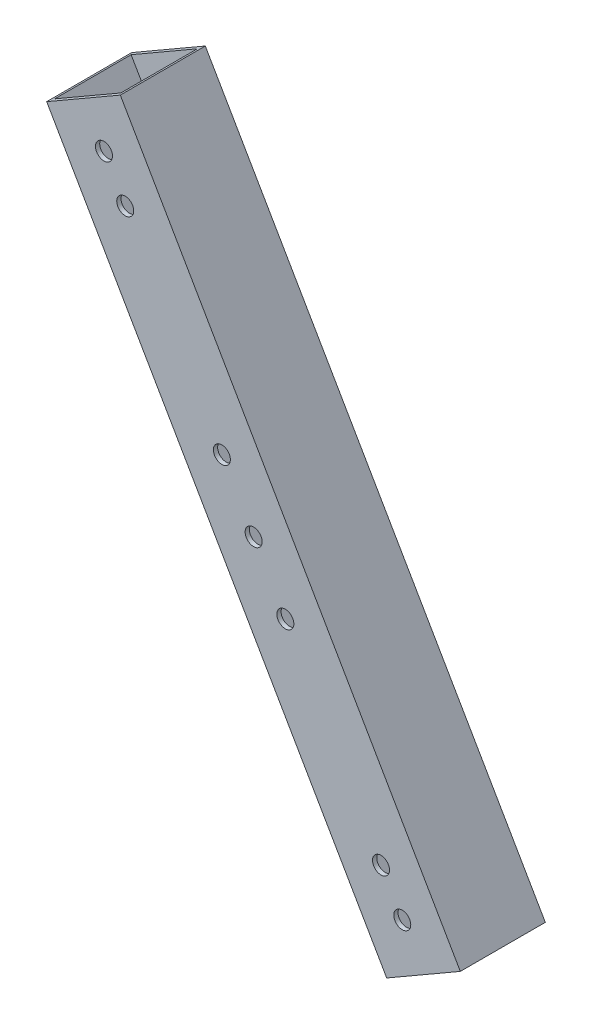
ISO-10303-21;
HEADER;
FILE_DESCRIPTION(('STEP AP214'),'2;1');
FILE_NAME('part.step','',(''),(''),'','','');
FILE_SCHEMA(('AUTOMOTIVE_DESIGN { 1 0 10303 214 1 1 1 1 }'));
ENDSEC;
DATA;
#1=APPLICATION_CONTEXT('core data for automotive mechanical design processes');
#2=APPLICATION_PROTOCOL_DEFINITION('international standard','automotive_design',2000,#1);
#3=PRODUCT_CONTEXT('',#1,'mechanical');
#4=PRODUCT('Part','Part','',(#3));
#5=PRODUCT_RELATED_PRODUCT_CATEGORY('part','',(#4));
#6=PRODUCT_DEFINITION_FORMATION('','',#4);
#7=PRODUCT_DEFINITION_CONTEXT('part definition',#1,'design');
#8=PRODUCT_DEFINITION('design','',#6,#7);
#9=PRODUCT_DEFINITION_SHAPE('','',#8);
#10=(LENGTH_UNIT() NAMED_UNIT(*) SI_UNIT(.MILLI.,.METRE.));
#11=(NAMED_UNIT(*) PLANE_ANGLE_UNIT() SI_UNIT($,.RADIAN.));
#12=(NAMED_UNIT(*) SI_UNIT($,.STERADIAN.) SOLID_ANGLE_UNIT());
#13=UNCERTAINTY_MEASURE_WITH_UNIT(LENGTH_MEASURE(1.E-05),#10,'distance_accuracy_value','');
#14=(GEOMETRIC_REPRESENTATION_CONTEXT(3) GLOBAL_UNCERTAINTY_ASSIGNED_CONTEXT((#13)) GLOBAL_UNIT_ASSIGNED_CONTEXT((#10,
#11,#12)) REPRESENTATION_CONTEXT('',''));
#15=CARTESIAN_POINT('',(0.,0.,0.));
#16=DIRECTION('',(0.,0.,1.));
#17=DIRECTION('',(1.,0.,0.));
#18=AXIS2_PLACEMENT_3D('',#15,#16,#17);
#19=CARTESIAN_POINT('',(-35.2463581705699,60.4985392870756,20.));
#20=DIRECTION('',(0.,0.,-1.));
#21=DIRECTION('',(-1.,0.,0.));
#22=AXIS2_PLACEMENT_3D('',#19,#20,#21);
#23=CYLINDRICAL_SURFACE('',#22,2.00000000000002);
#24=CARTESIAN_POINT('',(-35.2463581705699,60.4985392870756,19.));
#25=DIRECTION('',(0.,0.,1.));
#26=DIRECTION('',(1.,0.,0.));
#27=AXIS2_PLACEMENT_3D('',#24,#25,#26);
#28=CIRCLE('',#27,2.00000000000002);
#29=CARTESIAN_POINT('',(-33.2463581705699,60.4985392870756,19.));
#30=VERTEX_POINT('',#29);
#31=EDGE_CURVE('E193',#30,#30,#28,.T.);
#32=ORIENTED_EDGE('',*,*,#31,.F.);
#33=EDGE_LOOP('',(#32));
#34=FACE_BOUND('',#33,.T.);
#35=CARTESIAN_POINT('',(-35.2463581705699,60.4985392870756,20.));
#36=DIRECTION('',(0.,0.,1.));
#37=DIRECTION('',(1.,0.,0.));
#38=AXIS2_PLACEMENT_3D('',#35,#36,#37);
#39=CIRCLE('',#38,2.00000000000002);
#40=CARTESIAN_POINT('',(-33.2463581705699,60.4985392870756,20.));
#41=VERTEX_POINT('',#40);
#42=EDGE_CURVE('E250',#41,#41,#39,.T.);
#43=ORIENTED_EDGE('',*,*,#42,.T.);
#44=EDGE_LOOP('',(#43));
#45=FACE_BOUND('',#44,.T.);
#46=ADVANCED_FACE('F45',(#34,#45),#23,.F.);
#47=CARTESIAN_POINT('',(-30.2463581705699,51.8382852492312,20.));
#48=DIRECTION('',(0.,0.,-1.));
#49=DIRECTION('',(-1.,0.,0.));
#50=AXIS2_PLACEMENT_3D('',#47,#48,#49);
#51=CYLINDRICAL_SURFACE('',#50,1.99999999999997);
#52=CARTESIAN_POINT('',(-30.2463581705699,51.8382852492312,19.));
#53=DIRECTION('',(0.,0.,1.));
#54=DIRECTION('',(1.,0.,0.));
#55=AXIS2_PLACEMENT_3D('',#52,#53,#54);
#56=CIRCLE('',#55,1.99999999999997);
#57=CARTESIAN_POINT('',(-28.2463581705699,51.8382852492312,19.));
#58=VERTEX_POINT('',#57);
#59=EDGE_CURVE('E189',#58,#58,#56,.T.);
#60=ORIENTED_EDGE('',*,*,#59,.F.);
#61=EDGE_LOOP('',(#60));
#62=FACE_BOUND('',#61,.T.);
#63=CARTESIAN_POINT('',(-30.2463581705699,51.8382852492312,20.));
#64=DIRECTION('',(0.,0.,1.));
#65=DIRECTION('',(1.,0.,0.));
#66=AXIS2_PLACEMENT_3D('',#63,#64,#65);
#67=CIRCLE('',#66,1.99999999999997);
#68=CARTESIAN_POINT('',(-28.2463581705699,51.8382852492312,20.));
#69=VERTEX_POINT('',#68);
#70=EDGE_CURVE('E242',#69,#69,#67,.T.);
#71=ORIENTED_EDGE('',*,*,#70,.T.);
#72=EDGE_LOOP('',(#71));
#73=FACE_BOUND('',#72,.T.);
#74=ADVANCED_FACE('F325',(#62,#73),#51,.F.);
#75=CARTESIAN_POINT('',(-7.50186371385041,12.5282612160935,20.));
#76=DIRECTION('',(0.,0.,-1.));
#77=DIRECTION('',(-1.,0.,0.));
#78=AXIS2_PLACEMENT_3D('',#75,#76,#77);
#79=CYLINDRICAL_SURFACE('',#78,2.00000000000002);
#80=CARTESIAN_POINT('',(-7.50186371385041,12.5282612160935,19.));
#81=DIRECTION('',(0.,0.,1.));
#82=DIRECTION('',(1.,0.,0.));
#83=AXIS2_PLACEMENT_3D('',#80,#81,#82);
#84=CIRCLE('',#83,2.00000000000002);
#85=CARTESIAN_POINT('',(-5.50186371385038,12.5282612160935,19.));
#86=VERTEX_POINT('',#85);
#87=EDGE_CURVE('E185',#86,#86,#84,.T.);
#88=ORIENTED_EDGE('',*,*,#87,.F.);
#89=EDGE_LOOP('',(#88));
#90=FACE_BOUND('',#89,.T.);
#91=CARTESIAN_POINT('',(-7.50186371385041,12.5282612160935,20.));
#92=DIRECTION('',(0.,0.,1.));
#93=DIRECTION('',(1.,0.,0.));
#94=AXIS2_PLACEMENT_3D('',#91,#92,#93);
#95=CIRCLE('',#94,2.00000000000002);
#96=CARTESIAN_POINT('',(-5.50186371385038,12.5282612160935,20.));
#97=VERTEX_POINT('',#96);
#98=EDGE_CURVE('E234',#97,#97,#95,.T.);
#99=ORIENTED_EDGE('',*,*,#98,.T.);
#100=EDGE_LOOP('',(#99));
#101=FACE_BOUND('',#100,.T.);
#102=ADVANCED_FACE('F333',(#90,#101),#79,.F.);
#103=CARTESIAN_POINT('',(-0.0377448382468809,-0.482835817502303,20.));
#104=DIRECTION('',(0.,0.,-1.));
#105=DIRECTION('',(-1.,0.,0.));
#106=AXIS2_PLACEMENT_3D('',#103,#104,#105);
#107=CYLINDRICAL_SURFACE('',#106,2.);
#108=CARTESIAN_POINT('',(-0.0377448382468809,-0.482835817502303,19.));
#109=DIRECTION('',(0.,0.,1.));
#110=DIRECTION('',(1.,0.,0.));
#111=AXIS2_PLACEMENT_3D('',#108,#109,#110);
#112=CIRCLE('',#111,2.);
#113=CARTESIAN_POINT('',(1.96225516175312,-0.482835817502303,19.));
#114=VERTEX_POINT('',#113);
#115=EDGE_CURVE('E181',#114,#114,#112,.T.);
#116=ORIENTED_EDGE('',*,*,#115,.F.);
#117=EDGE_LOOP('',(#116));
#118=FACE_BOUND('',#117,.T.);
#119=CARTESIAN_POINT('',(-0.0377448382468809,-0.482835817502303,20.));
#120=DIRECTION('',(0.,0.,1.));
#121=DIRECTION('',(1.,0.,0.));
#122=AXIS2_PLACEMENT_3D('',#119,#120,#121);
#123=CIRCLE('',#122,2.);
#124=CARTESIAN_POINT('',(1.96225516175312,-0.482835817502303,20.));
#125=VERTEX_POINT('',#124);
#126=EDGE_CURVE('E226',#125,#125,#123,.T.);
#127=ORIENTED_EDGE('',*,*,#126,.T.);
#128=EDGE_LOOP('',(#127));
#129=FACE_BOUND('',#128,.T.);
#130=ADVANCED_FACE('F407',(#118,#129),#107,.F.);
#131=CARTESIAN_POINT('',(7.42637403735612,-13.4939328510983,20.));
#132=DIRECTION('',(0.,0.,-1.));
#133=DIRECTION('',(-1.,0.,0.));
#134=AXIS2_PLACEMENT_3D('',#131,#132,#133);
#135=CYLINDRICAL_SURFACE('',#134,1.99999999999998);
#136=CARTESIAN_POINT('',(7.42637403735612,-13.4939328510983,19.));
#137=DIRECTION('',(0.,0.,1.));
#138=DIRECTION('',(1.,0.,0.));
#139=AXIS2_PLACEMENT_3D('',#136,#137,#138);
#140=CIRCLE('',#139,1.99999999999998);
#141=CARTESIAN_POINT('',(9.4263740373561,-13.4939328510983,19.));
#142=VERTEX_POINT('',#141);
#143=EDGE_CURVE('E177',#142,#142,#140,.T.);
#144=ORIENTED_EDGE('',*,*,#143,.F.);
#145=EDGE_LOOP('',(#144));
#146=FACE_BOUND('',#145,.T.);
#147=CARTESIAN_POINT('',(7.42637403735612,-13.4939328510983,20.));
#148=DIRECTION('',(0.,0.,1.));
#149=DIRECTION('',(1.,0.,0.));
#150=AXIS2_PLACEMENT_3D('',#147,#148,#149);
#151=CIRCLE('',#150,1.99999999999998);
#152=CARTESIAN_POINT('',(9.4263740373561,-13.4939328510983,20.));
#153=VERTEX_POINT('',#152);
#154=EDGE_CURVE('E218',#153,#153,#151,.T.);
#155=ORIENTED_EDGE('',*,*,#154,.T.);
#156=EDGE_LOOP('',(#155));
#157=FACE_BOUND('',#156,.T.);
#158=ADVANCED_FACE('F397',(#146,#157),#135,.F.);
#159=CARTESIAN_POINT('',(29.9331337537406,-52.3956523373563,20.));
#160=DIRECTION('',(0.,0.,-1.));
#161=DIRECTION('',(-1.,0.,0.));
#162=AXIS2_PLACEMENT_3D('',#159,#160,#161);
#163=CYLINDRICAL_SURFACE('',#162,2.00000000000002);
#164=CARTESIAN_POINT('',(29.9331337537406,-52.3956523373563,19.));
#165=DIRECTION('',(0.,0.,1.));
#166=DIRECTION('',(1.,0.,0.));
#167=AXIS2_PLACEMENT_3D('',#164,#165,#166);
#168=CIRCLE('',#167,2.00000000000002);
#169=CARTESIAN_POINT('',(31.9331337537406,-52.3956523373563,19.));
#170=VERTEX_POINT('',#169);
#171=EDGE_CURVE('E173',#170,#170,#168,.T.);
#172=ORIENTED_EDGE('',*,*,#171,.F.);
#173=EDGE_LOOP('',(#172));
#174=FACE_BOUND('',#173,.T.);
#175=CARTESIAN_POINT('',(29.9331337537406,-52.3956523373563,20.));
#176=DIRECTION('',(0.,0.,1.));
#177=DIRECTION('',(1.,0.,0.));
#178=AXIS2_PLACEMENT_3D('',#175,#176,#177);
#179=CIRCLE('',#178,2.00000000000002);
#180=CARTESIAN_POINT('',(31.9331337537406,-52.3956523373563,20.));
#181=VERTEX_POINT('',#180);
#182=EDGE_CURVE('E210',#181,#181,#179,.T.);
#183=ORIENTED_EDGE('',*,*,#182,.T.);
#184=EDGE_LOOP('',(#183));
#185=FACE_BOUND('',#184,.T.);
#186=ADVANCED_FACE('F387',(#174,#185),#163,.F.);
#187=CARTESIAN_POINT('',(34.9331337537406,-61.0559063752009,20.));
#188=DIRECTION('',(0.,0.,-1.));
#189=DIRECTION('',(-1.,0.,0.));
#190=AXIS2_PLACEMENT_3D('',#187,#188,#189);
#191=CYLINDRICAL_SURFACE('',#190,2.00000000000004);
#192=CARTESIAN_POINT('',(34.9331337537406,-61.0559063752009,19.));
#193=DIRECTION('',(0.,0.,1.));
#194=DIRECTION('',(1.,0.,0.));
#195=AXIS2_PLACEMENT_3D('',#192,#193,#194);
#196=CIRCLE('',#195,2.00000000000004);
#197=CARTESIAN_POINT('',(36.9331337537407,-61.0559063752009,19.));
#198=VERTEX_POINT('',#197);
#199=EDGE_CURVE('E172',#198,#198,#196,.T.);
#200=ORIENTED_EDGE('',*,*,#199,.F.);
#201=EDGE_LOOP('',(#200));
#202=FACE_BOUND('',#201,.T.);
#203=CARTESIAN_POINT('',(34.9331337537406,-61.0559063752009,20.));
#204=DIRECTION('',(0.,0.,1.));
#205=DIRECTION('',(1.,0.,0.));
#206=AXIS2_PLACEMENT_3D('',#203,#204,#205);
#207=CIRCLE('',#206,2.00000000000004);
#208=CARTESIAN_POINT('',(36.9331337537407,-61.0559063752009,20.));
#209=VERTEX_POINT('',#208);
#210=EDGE_CURVE('E202',#209,#209,#207,.T.);
#211=ORIENTED_EDGE('',*,*,#210,.T.);
#212=EDGE_LOOP('',(#211));
#213=FACE_BOUND('',#212,.T.);
#214=ADVANCED_FACE('F378',(#202,#213),#191,.F.);
#215=CARTESIAN_POINT('',(0.,0.,20.));
#216=DIRECTION('',(0.,0.,1.));
#217=DIRECTION('',(1.,0.,0.));
#218=AXIS2_PLACEMENT_3D('',#215,#216,#217);
#219=PLANE('',#218);
#220=ORIENTED_EDGE('',*,*,#182,.F.);
#221=EDGE_LOOP('',(#220));
#222=FACE_BOUND('',#221,.T.);
#223=ORIENTED_EDGE('',*,*,#126,.F.);
#224=EDGE_LOOP('',(#223));
#225=FACE_BOUND('',#224,.T.);
#226=ORIENTED_EDGE('',*,*,#70,.F.);
#227=EDGE_LOOP('',(#226));
#228=FACE_BOUND('',#227,.T.);
#229=DIRECTION('',(-0.866025403784442,-0.499999999999995,0.));
#230=VECTOR('',#229,1.);
#231=CARTESIAN_POINT('',(-31.4066122084144,73.8479041924647,20.));
#232=LINE('',#231,#230);
#233=CARTESIAN_POINT('',(-31.4066122084144,73.8479041924647,20.));
#234=VERTEX_POINT('',#233);
#235=CARTESIAN_POINT('',(-48.7271202841034,63.8479041924647,20.));
#236=VERTEX_POINT('',#235);
#237=EDGE_CURVE('E258',#234,#236,#232,.T.);
#238=ORIENTED_EDGE('',*,*,#237,.T.);
#239=DIRECTION('',(0.5,-0.866025403784439,0.));
#240=VECTOR('',#239,1.);
#241=CARTESIAN_POINT('',(-48.7271202841034,63.8479041924647,20.));
#242=LINE('',#241,#240);
#243=CARTESIAN_POINT('',(31.2728797158966,-74.7161604130455,20.));
#244=VERTEX_POINT('',#243);
#245=EDGE_CURVE('E262',#236,#244,#242,.T.);
#246=ORIENTED_EDGE('',*,*,#245,.T.);
#247=DIRECTION('',(0.866025403784436,0.500000000000004,0.));
#248=VECTOR('',#247,1.);
#249=CARTESIAN_POINT('',(31.2728797158966,-74.7161604130455,20.));
#250=LINE('',#249,#248);
#251=CARTESIAN_POINT('',(48.5933877915854,-64.7161604130454,20.));
#252=VERTEX_POINT('',#251);
#253=EDGE_CURVE('E266',#244,#252,#250,.T.);
#254=ORIENTED_EDGE('',*,*,#253,.T.);
#255=DIRECTION('',(-0.499999999999999,0.866025403784439,0.));
#256=VECTOR('',#255,1.);
#257=CARTESIAN_POINT('',(48.5933877915854,-64.7161604130454,20.));
#258=LINE('',#257,#256);
#259=EDGE_CURVE('E269',#252,#234,#258,.T.);
#260=ORIENTED_EDGE('',*,*,#259,.T.);
#261=EDGE_LOOP('',(#238,#246,#254,#260));
#262=FACE_BOUND('',#261,.T.);
#263=ORIENTED_EDGE('',*,*,#42,.F.);
#264=EDGE_LOOP('',(#263));
#265=FACE_BOUND('',#264,.T.);
#266=ORIENTED_EDGE('',*,*,#98,.F.);
#267=EDGE_LOOP('',(#266));
#268=FACE_BOUND('',#267,.T.);
#269=ORIENTED_EDGE('',*,*,#154,.F.);
#270=EDGE_LOOP('',(#269));
#271=FACE_BOUND('',#270,.T.);
#272=ORIENTED_EDGE('',*,*,#210,.F.);
#273=EDGE_LOOP('',(#272));
#274=FACE_BOUND('',#273,.T.);
#275=ADVANCED_FACE('F358',(#222,#225,#228,#262,#265,#268,#271,#274),#219,.T.);
#276=CARTESIAN_POINT('',(0.,0.,0.));
#277=DIRECTION('',(0.,0.,1.));
#278=DIRECTION('',(1.,0.,0.));
#279=AXIS2_PLACEMENT_3D('',#276,#277,#278);
#280=PLANE('',#279);
#281=DIRECTION('',(-0.866025403784442,-0.499999999999995,0.));
#282=VECTOR('',#281,1.);
#283=CARTESIAN_POINT('',(-31.4066122084144,73.8479041924647,0.));
#284=LINE('',#283,#282);
#285=CARTESIAN_POINT('',(-31.4066122084144,73.8479041924647,0.));
#286=VERTEX_POINT('',#285);
#287=CARTESIAN_POINT('',(-48.7271202841034,63.8479041924647,0.));
#288=VERTEX_POINT('',#287);
#289=EDGE_CURVE('E254',#286,#288,#284,.T.);
#290=ORIENTED_EDGE('',*,*,#289,.F.);
#291=DIRECTION('',(-0.499999999999999,0.866025403784439,0.));
#292=VECTOR('',#291,1.);
#293=CARTESIAN_POINT('',(48.5933877915854,-64.7161604130454,0.));
#294=LINE('',#293,#292);
#295=CARTESIAN_POINT('',(48.5933877915854,-64.7161604130454,0.));
#296=VERTEX_POINT('',#295);
#297=EDGE_CURVE('E263',#296,#286,#294,.T.);
#298=ORIENTED_EDGE('',*,*,#297,.F.);
#299=DIRECTION('',(0.866025403784436,0.500000000000004,0.));
#300=VECTOR('',#299,1.);
#301=CARTESIAN_POINT('',(31.2728797158966,-74.7161604130455,0.));
#302=LINE('',#301,#300);
#303=CARTESIAN_POINT('',(31.2728797158966,-74.7161604130455,0.));
#304=VERTEX_POINT('',#303);
#305=EDGE_CURVE('E279',#304,#296,#302,.T.);
#306=ORIENTED_EDGE('',*,*,#305,.F.);
#307=DIRECTION('',(0.5,-0.866025403784439,0.));
#308=VECTOR('',#307,1.);
#309=CARTESIAN_POINT('',(-48.7271202841034,63.8479041924647,0.));
#310=LINE('',#309,#308);
#311=EDGE_CURVE('E276',#288,#304,#310,.T.);
#312=ORIENTED_EDGE('',*,*,#311,.F.);
#313=EDGE_LOOP('',(#290,#298,#306,#312));
#314=FACE_BOUND('',#313,.T.);
#315=CARTESIAN_POINT('',(-35.2463581705699,60.4985392870756,0.));
#316=DIRECTION('',(0.,0.,1.));
#317=DIRECTION('',(1.,0.,0.));
#318=AXIS2_PLACEMENT_3D('',#315,#316,#317);
#319=CIRCLE('',#318,2.00000000000002);
#320=CARTESIAN_POINT('',(-33.2463581705699,60.4985392870756,0.));
#321=VERTEX_POINT('',#320);
#322=EDGE_CURVE('E246',#321,#321,#319,.T.);
#323=ORIENTED_EDGE('',*,*,#322,.T.);
#324=EDGE_LOOP('',(#323));
#325=FACE_BOUND('',#324,.T.);
#326=CARTESIAN_POINT('',(-30.2463581705699,51.8382852492312,0.));
#327=DIRECTION('',(0.,0.,1.));
#328=DIRECTION('',(1.,0.,0.));
#329=AXIS2_PLACEMENT_3D('',#326,#327,#328);
#330=CIRCLE('',#329,1.99999999999997);
#331=CARTESIAN_POINT('',(-28.2463581705699,51.8382852492312,0.));
#332=VERTEX_POINT('',#331);
#333=EDGE_CURVE('E238',#332,#332,#330,.T.);
#334=ORIENTED_EDGE('',*,*,#333,.T.);
#335=EDGE_LOOP('',(#334));
#336=FACE_BOUND('',#335,.T.);
#337=CARTESIAN_POINT('',(-7.50186371385041,12.5282612160935,0.));
#338=DIRECTION('',(0.,0.,1.));
#339=DIRECTION('',(1.,0.,0.));
#340=AXIS2_PLACEMENT_3D('',#337,#338,#339);
#341=CIRCLE('',#340,2.00000000000002);
#342=CARTESIAN_POINT('',(-5.50186371385038,12.5282612160935,0.));
#343=VERTEX_POINT('',#342);
#344=EDGE_CURVE('E230',#343,#343,#341,.T.);
#345=ORIENTED_EDGE('',*,*,#344,.T.);
#346=EDGE_LOOP('',(#345));
#347=FACE_BOUND('',#346,.T.);
#348=CARTESIAN_POINT('',(-0.0377448382468809,-0.482835817502303,0.));
#349=DIRECTION('',(0.,0.,1.));
#350=DIRECTION('',(1.,0.,0.));
#351=AXIS2_PLACEMENT_3D('',#348,#349,#350);
#352=CIRCLE('',#351,2.);
#353=CARTESIAN_POINT('',(1.96225516175312,-0.482835817502303,0.));
#354=VERTEX_POINT('',#353);
#355=EDGE_CURVE('E222',#354,#354,#352,.T.);
#356=ORIENTED_EDGE('',*,*,#355,.T.);
#357=EDGE_LOOP('',(#356));
#358=FACE_BOUND('',#357,.T.);
#359=CARTESIAN_POINT('',(7.42637403735612,-13.4939328510983,0.));
#360=DIRECTION('',(0.,0.,1.));
#361=DIRECTION('',(1.,0.,0.));
#362=AXIS2_PLACEMENT_3D('',#359,#360,#361);
#363=CIRCLE('',#362,1.99999999999998);
#364=CARTESIAN_POINT('',(9.4263740373561,-13.4939328510983,0.));
#365=VERTEX_POINT('',#364);
#366=EDGE_CURVE('E214',#365,#365,#363,.T.);
#367=ORIENTED_EDGE('',*,*,#366,.T.);
#368=EDGE_LOOP('',(#367));
#369=FACE_BOUND('',#368,.T.);
#370=CARTESIAN_POINT('',(29.9331337537406,-52.3956523373563,0.));
#371=DIRECTION('',(0.,0.,1.));
#372=DIRECTION('',(1.,0.,0.));
#373=AXIS2_PLACEMENT_3D('',#370,#371,#372);
#374=CIRCLE('',#373,2.00000000000002);
#375=CARTESIAN_POINT('',(31.9331337537406,-52.3956523373563,0.));
#376=VERTEX_POINT('',#375);
#377=EDGE_CURVE('E206',#376,#376,#374,.T.);
#378=ORIENTED_EDGE('',*,*,#377,.T.);
#379=EDGE_LOOP('',(#378));
#380=FACE_BOUND('',#379,.T.);
#381=CARTESIAN_POINT('',(34.9331337537406,-61.0559063752009,0.));
#382=DIRECTION('',(0.,0.,1.));
#383=DIRECTION('',(1.,0.,0.));
#384=AXIS2_PLACEMENT_3D('',#381,#382,#383);
#385=CIRCLE('',#384,2.00000000000004);
#386=CARTESIAN_POINT('',(36.9331337537407,-61.0559063752009,0.));
#387=VERTEX_POINT('',#386);
#388=EDGE_CURVE('E201',#387,#387,#385,.T.);
#389=ORIENTED_EDGE('',*,*,#388,.T.);
#390=EDGE_LOOP('',(#389));
#391=FACE_BOUND('',#390,.T.);
#392=ADVANCED_FACE('F355',(#314,#325,#336,#347,#358,#369,#380,#391),#280,.F.);
#393=CARTESIAN_POINT('',(-31.4066122084144,73.8479041924647,20.));
#394=DIRECTION('',(0.499999999999995,-0.866025403784442,0.));
#395=DIRECTION('',(0.866025403784442,0.499999999999995,0.));
#396=AXIS2_PLACEMENT_3D('',#393,#394,#395);
#397=PLANE('',#396);
#398=DIRECTION('',(-0.866025403784442,-0.499999999999995,0.));
#399=VECTOR('',#398,1.);
#400=CARTESIAN_POINT('',(-47.8610948803189,64.3479041924647,1.));
#401=LINE('',#400,#399);
#402=CARTESIAN_POINT('',(-32.2726376121989,73.3479041924647,0.999999999999998));
#403=VERTEX_POINT('',#402);
#404=CARTESIAN_POINT('',(-47.8610948803189,64.3479041924647,1.));
#405=VERTEX_POINT('',#404);
#406=EDGE_CURVE('E123',#403,#405,#401,.T.);
#407=ORIENTED_EDGE('',*,*,#406,.F.);
#408=DIRECTION('',(0.,0.,-1.));
#409=VECTOR('',#408,1.);
#410=CARTESIAN_POINT('',(-32.2726376121989,73.3479041924647,0.999999999999999));
#411=LINE('',#410,#409);
#412=CARTESIAN_POINT('',(-32.2726376121989,73.3479041924647,19.));
#413=VERTEX_POINT('',#412);
#414=EDGE_CURVE('E61',#413,#403,#411,.T.);
#415=ORIENTED_EDGE('',*,*,#414,.F.);
#416=DIRECTION('',(0.866025403784442,0.499999999999995,0.));
#417=VECTOR('',#416,1.);
#418=CARTESIAN_POINT('',(-47.8610948803189,64.3479041924647,19.));
#419=LINE('',#418,#417);
#420=CARTESIAN_POINT('',(-47.8610948803189,64.3479041924647,19.));
#421=VERTEX_POINT('',#420);
#422=EDGE_CURVE('E130',#421,#413,#419,.T.);
#423=ORIENTED_EDGE('',*,*,#422,.F.);
#424=DIRECTION('',(0.,0.,1.));
#425=VECTOR('',#424,1.);
#426=CARTESIAN_POINT('',(-47.8610948803189,64.3479041924647,1.));
#427=LINE('',#426,#425);
#428=EDGE_CURVE('E114',#405,#421,#427,.T.);
#429=ORIENTED_EDGE('',*,*,#428,.F.);
#430=EDGE_LOOP('',(#407,#415,#423,#429));
#431=FACE_BOUND('',#430,.T.);
#432=ORIENTED_EDGE('',*,*,#289,.T.);
#433=DIRECTION('',(0.,0.,-1.));
#434=VECTOR('',#433,1.);
#435=CARTESIAN_POINT('',(-48.7271202841034,63.8479041924647,20.));
#436=LINE('',#435,#434);
#437=EDGE_CURVE('E295',#236,#288,#436,.T.);
#438=ORIENTED_EDGE('',*,*,#437,.F.);
#439=ORIENTED_EDGE('',*,*,#237,.F.);
#440=DIRECTION('',(0.,0.,-1.));
#441=VECTOR('',#440,1.);
#442=CARTESIAN_POINT('',(-31.4066122084144,73.8479041924647,20.));
#443=LINE('',#442,#441);
#444=EDGE_CURVE('E272',#234,#286,#443,.T.);
#445=ORIENTED_EDGE('',*,*,#444,.T.);
#446=EDGE_LOOP('',(#432,#438,#439,#445));
#447=FACE_BOUND('',#446,.T.);
#448=ADVANCED_FACE('F47',(#431,#447),#397,.F.);
#449=CARTESIAN_POINT('',(-48.7271202841034,63.8479041924647,20.));
#450=DIRECTION('',(0.866025403784439,0.5,0.));
#451=DIRECTION('',(-0.5,0.866025403784439,0.));
#452=AXIS2_PLACEMENT_3D('',#449,#450,#451);
#453=PLANE('',#452);
#454=ORIENTED_EDGE('',*,*,#311,.T.);
#455=DIRECTION('',(0.,0.,-1.));
#456=VECTOR('',#455,1.);
#457=CARTESIAN_POINT('',(31.2728797158966,-74.7161604130455,20.));
#458=LINE('',#457,#456);
#459=EDGE_CURVE('E291',#244,#304,#458,.T.);
#460=ORIENTED_EDGE('',*,*,#459,.F.);
#461=ORIENTED_EDGE('',*,*,#245,.F.);
#462=ORIENTED_EDGE('',*,*,#437,.T.);
#463=EDGE_LOOP('',(#454,#460,#461,#462));
#464=FACE_BOUND('',#463,.T.);
#465=ADVANCED_FACE('F459',(#464),#453,.F.);
#466=CARTESIAN_POINT('',(31.2728797158966,-74.7161604130455,20.));
#467=DIRECTION('',(-0.500000000000005,0.866025403784436,0.));
#468=DIRECTION('',(-0.866025403784436,-0.500000000000005,0.));
#469=AXIS2_PLACEMENT_3D('',#466,#467,#468);
#470=PLANE('',#469);
#471=DIRECTION('',(0.866025403784436,0.500000000000005,0.));
#472=VECTOR('',#471,1.);
#473=CARTESIAN_POINT('',(31.2728797158966,-74.7161604130455,19.));
#474=LINE('',#473,#472);
#475=CARTESIAN_POINT('',(32.1389051196803,-74.2161604130459,19.));
#476=VERTEX_POINT('',#475);
#477=CARTESIAN_POINT('',(47.7273623878002,-65.2161604130459,19.));
#478=VERTEX_POINT('',#477);
#479=EDGE_CURVE('E197',#476,#478,#474,.T.);
#480=ORIENTED_EDGE('',*,*,#479,.T.);
#481=DIRECTION('',(0.,0.,-1.));
#482=VECTOR('',#481,1.);
#483=CARTESIAN_POINT('',(47.7273623878002,-65.2161604130459,20.));
#484=LINE('',#483,#482);
#485=CARTESIAN_POINT('',(47.7273623878002,-65.2161604130459,0.999999999999998));
#486=VERTEX_POINT('',#485);
#487=EDGE_CURVE('E11',#478,#486,#484,.T.);
#488=ORIENTED_EDGE('',*,*,#487,.T.);
#489=DIRECTION('',(-0.866025403784436,-0.500000000000005,0.));
#490=VECTOR('',#489,1.);
#491=CARTESIAN_POINT('',(31.2728797158966,-74.7161604130455,1.));
#492=LINE('',#491,#490);
#493=CARTESIAN_POINT('',(32.1389051196803,-74.2161604130459,1.));
#494=VERTEX_POINT('',#493);
#495=EDGE_CURVE('E169',#486,#494,#492,.T.);
#496=ORIENTED_EDGE('',*,*,#495,.T.);
#497=DIRECTION('',(0.,0.,1.));
#498=VECTOR('',#497,1.);
#499=CARTESIAN_POINT('',(32.1389051196803,-74.2161604130459,20.));
#500=LINE('',#499,#498);
#501=EDGE_CURVE('E54',#494,#476,#500,.T.);
#502=ORIENTED_EDGE('',*,*,#501,.T.);
#503=EDGE_LOOP('',(#480,#488,#496,#502));
#504=FACE_BOUND('',#503,.T.);
#505=ORIENTED_EDGE('',*,*,#305,.T.);
#506=DIRECTION('',(0.,0.,-1.));
#507=VECTOR('',#506,1.);
#508=CARTESIAN_POINT('',(48.5933877915854,-64.7161604130454,20.));
#509=LINE('',#508,#507);
#510=EDGE_CURVE('E287',#252,#296,#509,.T.);
#511=ORIENTED_EDGE('',*,*,#510,.F.);
#512=ORIENTED_EDGE('',*,*,#253,.F.);
#513=ORIENTED_EDGE('',*,*,#459,.T.);
#514=EDGE_LOOP('',(#505,#511,#512,#513));
#515=FACE_BOUND('',#514,.T.);
#516=ADVANCED_FACE('F306',(#504,#515),#470,.F.);
#517=CARTESIAN_POINT('',(48.5933877915854,-64.7161604130454,20.));
#518=DIRECTION('',(-0.866025403784439,-0.499999999999999,0.));
#519=DIRECTION('',(0.499999999999999,-0.866025403784439,0.));
#520=AXIS2_PLACEMENT_3D('',#517,#518,#519);
#521=PLANE('',#520);
#522=ORIENTED_EDGE('',*,*,#297,.T.);
#523=ORIENTED_EDGE('',*,*,#444,.F.);
#524=ORIENTED_EDGE('',*,*,#259,.F.);
#525=ORIENTED_EDGE('',*,*,#510,.T.);
#526=EDGE_LOOP('',(#522,#523,#524,#525));
#527=FACE_BOUND('',#526,.T.);
#528=ADVANCED_FACE('F341',(#527),#521,.F.);
#529=CARTESIAN_POINT('',(-35.2463581705699,60.4985392870756,1.));
#530=DIRECTION('',(0.,0.,-1.));
#531=DIRECTION('',(-1.,0.,0.));
#532=AXIS2_PLACEMENT_3D('',#529,#530,#531);
#533=CIRCLE('',#532,2.00000000000002);
#534=CARTESIAN_POINT('',(-37.2463581705699,60.4985392870756,1.));
#535=VERTEX_POINT('',#534);
#536=EDGE_CURVE('E165',#535,#535,#533,.T.);
#537=ORIENTED_EDGE('',*,*,#536,.F.);
#538=EDGE_LOOP('',(#537));
#539=FACE_BOUND('',#538,.T.);
#540=ORIENTED_EDGE('',*,*,#322,.F.);
#541=EDGE_LOOP('',(#540));
#542=FACE_BOUND('',#541,.T.);
#543=ADVANCED_FACE('F328',(#539,#542),#23,.F.);
#544=CARTESIAN_POINT('',(-30.2463581705699,51.8382852492312,1.));
#545=DIRECTION('',(0.,0.,-1.));
#546=DIRECTION('',(-1.,0.,0.));
#547=AXIS2_PLACEMENT_3D('',#544,#545,#546);
#548=CIRCLE('',#547,1.99999999999997);
#549=CARTESIAN_POINT('',(-32.2463581705699,51.8382852492312,1.));
#550=VERTEX_POINT('',#549);
#551=EDGE_CURVE('E161',#550,#550,#548,.T.);
#552=ORIENTED_EDGE('',*,*,#551,.F.);
#553=EDGE_LOOP('',(#552));
#554=FACE_BOUND('',#553,.T.);
#555=ORIENTED_EDGE('',*,*,#333,.F.);
#556=EDGE_LOOP('',(#555));
#557=FACE_BOUND('',#556,.T.);
#558=ADVANCED_FACE('F336',(#554,#557),#51,.F.);
#559=CARTESIAN_POINT('',(-7.50186371385041,12.5282612160935,1.));
#560=DIRECTION('',(0.,0.,-1.));
#561=DIRECTION('',(-1.,0.,0.));
#562=AXIS2_PLACEMENT_3D('',#559,#560,#561);
#563=CIRCLE('',#562,2.00000000000002);
#564=CARTESIAN_POINT('',(-9.50186371385043,12.5282612160935,1.));
#565=VERTEX_POINT('',#564);
#566=EDGE_CURVE('E157',#565,#565,#563,.T.);
#567=ORIENTED_EDGE('',*,*,#566,.F.);
#568=EDGE_LOOP('',(#567));
#569=FACE_BOUND('',#568,.T.);
#570=ORIENTED_EDGE('',*,*,#344,.F.);
#571=EDGE_LOOP('',(#570));
#572=FACE_BOUND('',#571,.T.);
#573=ADVANCED_FACE('F347',(#569,#572),#79,.F.);
#574=CARTESIAN_POINT('',(-0.0377448382468809,-0.482835817502303,1.));
#575=DIRECTION('',(0.,0.,-1.));
#576=DIRECTION('',(-1.,0.,0.));
#577=AXIS2_PLACEMENT_3D('',#574,#575,#576);
#578=CIRCLE('',#577,2.);
#579=CARTESIAN_POINT('',(-2.03774483824688,-0.482835817502303,1.));
#580=VERTEX_POINT('',#579);
#581=EDGE_CURVE('E153',#580,#580,#578,.T.);
#582=ORIENTED_EDGE('',*,*,#581,.F.);
#583=EDGE_LOOP('',(#582));
#584=FACE_BOUND('',#583,.T.);
#585=ORIENTED_EDGE('',*,*,#355,.F.);
#586=EDGE_LOOP('',(#585));
#587=FACE_BOUND('',#586,.T.);
#588=ADVANCED_FACE('F414',(#584,#587),#107,.F.);
#589=CARTESIAN_POINT('',(7.42637403735612,-13.4939328510983,1.));
#590=DIRECTION('',(0.,0.,-1.));
#591=DIRECTION('',(-1.,0.,0.));
#592=AXIS2_PLACEMENT_3D('',#589,#590,#591);
#593=CIRCLE('',#592,1.99999999999998);
#594=CARTESIAN_POINT('',(5.42637403735613,-13.4939328510983,1.));
#595=VERTEX_POINT('',#594);
#596=EDGE_CURVE('E149',#595,#595,#593,.T.);
#597=ORIENTED_EDGE('',*,*,#596,.F.);
#598=EDGE_LOOP('',(#597));
#599=FACE_BOUND('',#598,.T.);
#600=ORIENTED_EDGE('',*,*,#366,.F.);
#601=EDGE_LOOP('',(#600));
#602=FACE_BOUND('',#601,.T.);
#603=ADVANCED_FACE('F384',(#599,#602),#135,.F.);
#604=CARTESIAN_POINT('',(29.9331337537406,-52.3956523373563,1.));
#605=DIRECTION('',(0.,0.,-1.));
#606=DIRECTION('',(-1.,0.,0.));
#607=AXIS2_PLACEMENT_3D('',#604,#605,#606);
#608=CIRCLE('',#607,2.00000000000002);
#609=CARTESIAN_POINT('',(27.9331337537406,-52.3956523373563,1.));
#610=VERTEX_POINT('',#609);
#611=EDGE_CURVE('E145',#610,#610,#608,.T.);
#612=ORIENTED_EDGE('',*,*,#611,.F.);
#613=EDGE_LOOP('',(#612));
#614=FACE_BOUND('',#613,.T.);
#615=ORIENTED_EDGE('',*,*,#377,.F.);
#616=EDGE_LOOP('',(#615));
#617=FACE_BOUND('',#616,.T.);
#618=ADVANCED_FACE('F375',(#614,#617),#163,.F.);
#619=CARTESIAN_POINT('',(34.9331337537406,-61.0559063752009,1.));
#620=DIRECTION('',(0.,0.,-1.));
#621=DIRECTION('',(-1.,0.,0.));
#622=AXIS2_PLACEMENT_3D('',#619,#620,#621);
#623=CIRCLE('',#622,2.00000000000004);
#624=CARTESIAN_POINT('',(32.9331337537406,-61.0559063752009,1.));
#625=VERTEX_POINT('',#624);
#626=EDGE_CURVE('E140',#625,#625,#623,.T.);
#627=ORIENTED_EDGE('',*,*,#626,.F.);
#628=EDGE_LOOP('',(#627));
#629=FACE_BOUND('',#628,.T.);
#630=ORIENTED_EDGE('',*,*,#388,.F.);
#631=EDGE_LOOP('',(#630));
#632=FACE_BOUND('',#631,.T.);
#633=ADVANCED_FACE('F373',(#629,#632),#191,.F.);
#634=CARTESIAN_POINT('',(52.0574894067224,-72.716160413046,0.999999999999999));
#635=DIRECTION('',(0.866025403784441,0.499999999999995,0.));
#636=DIRECTION('',(-0.499999999999995,0.866025403784442,0.));
#637=AXIS2_PLACEMENT_3D('',#634,#635,#636);
#638=PLANE('',#637);
#639=DIRECTION('',(-0.499999999999995,0.866025403784441,0.));
#640=VECTOR('',#639,1.);
#641=CARTESIAN_POINT('',(52.0574894067224,-72.716160413046,19.));
#642=LINE('',#641,#640);
#643=EDGE_CURVE('E137',#478,#413,#642,.T.);
#644=ORIENTED_EDGE('',*,*,#643,.T.);
#645=ORIENTED_EDGE('',*,*,#414,.T.);
#646=DIRECTION('',(-0.499999999999995,0.866025403784441,0.));
#647=VECTOR('',#646,1.);
#648=CARTESIAN_POINT('',(52.0574894067224,-72.716160413046,0.999999999999999));
#649=LINE('',#648,#647);
#650=EDGE_CURVE('E120',#486,#403,#649,.T.);
#651=ORIENTED_EDGE('',*,*,#650,.F.);
#652=ORIENTED_EDGE('',*,*,#487,.F.);
#653=EDGE_LOOP('',(#644,#645,#651,#652));
#654=FACE_BOUND('',#653,.T.);
#655=ADVANCED_FACE('F308',(#654),#638,.F.);
#656=CARTESIAN_POINT('',(36.4690321386024,-81.7161604130459,1.));
#657=DIRECTION('',(-0.866025403784441,-0.499999999999995,0.));
#658=DIRECTION('',(0.499999999999995,-0.866025403784442,0.));
#659=AXIS2_PLACEMENT_3D('',#656,#657,#658);
#660=PLANE('',#659);
#661=DIRECTION('',(-0.499999999999995,0.866025403784441,0.));
#662=VECTOR('',#661,1.);
#663=CARTESIAN_POINT('',(36.4690321386024,-81.7161604130459,1.));
#664=LINE('',#663,#662);
#665=EDGE_CURVE('E69',#494,#405,#664,.T.);
#666=ORIENTED_EDGE('',*,*,#665,.T.);
#667=ORIENTED_EDGE('',*,*,#428,.T.);
#668=DIRECTION('',(-0.499999999999995,0.866025403784441,0.));
#669=VECTOR('',#668,1.);
#670=CARTESIAN_POINT('',(36.4690321386024,-81.7161604130459,19.));
#671=LINE('',#670,#669);
#672=EDGE_CURVE('E119',#476,#421,#671,.T.);
#673=ORIENTED_EDGE('',*,*,#672,.F.);
#674=ORIENTED_EDGE('',*,*,#501,.F.);
#675=EDGE_LOOP('',(#666,#667,#673,#674));
#676=FACE_BOUND('',#675,.T.);
#677=ADVANCED_FACE('F111',(#676),#660,.F.);
#678=CARTESIAN_POINT('',(36.4690321386024,-81.7161604130459,19.));
#679=DIRECTION('',(0.,0.,1.));
#680=DIRECTION('',(1.,0.,0.));
#681=AXIS2_PLACEMENT_3D('',#678,#679,#680);
#682=PLANE('',#681);
#683=ORIENTED_EDGE('',*,*,#31,.T.);
#684=EDGE_LOOP('',(#683));
#685=FACE_BOUND('',#684,.T.);
#686=ORIENTED_EDGE('',*,*,#59,.T.);
#687=EDGE_LOOP('',(#686));
#688=FACE_BOUND('',#687,.T.);
#689=ORIENTED_EDGE('',*,*,#87,.T.);
#690=EDGE_LOOP('',(#689));
#691=FACE_BOUND('',#690,.T.);
#692=ORIENTED_EDGE('',*,*,#115,.T.);
#693=EDGE_LOOP('',(#692));
#694=FACE_BOUND('',#693,.T.);
#695=ORIENTED_EDGE('',*,*,#143,.T.);
#696=EDGE_LOOP('',(#695));
#697=FACE_BOUND('',#696,.T.);
#698=ORIENTED_EDGE('',*,*,#171,.T.);
#699=EDGE_LOOP('',(#698));
#700=FACE_BOUND('',#699,.T.);
#701=ORIENTED_EDGE('',*,*,#199,.T.);
#702=EDGE_LOOP('',(#701));
#703=FACE_BOUND('',#702,.T.);
#704=ORIENTED_EDGE('',*,*,#672,.T.);
#705=ORIENTED_EDGE('',*,*,#422,.T.);
#706=ORIENTED_EDGE('',*,*,#643,.F.);
#707=ORIENTED_EDGE('',*,*,#479,.F.);
#708=EDGE_LOOP('',(#704,#705,#706,#707));
#709=FACE_BOUND('',#708,.T.);
#710=ADVANCED_FACE('F311',(#685,#688,#691,#694,#697,#700,#703,#709),#682,.F.);
#711=CARTESIAN_POINT('',(36.4690321386024,-81.7161604130459,1.));
#712=DIRECTION('',(0.,0.,-1.));
#713=DIRECTION('',(-1.,0.,0.));
#714=AXIS2_PLACEMENT_3D('',#711,#712,#713);
#715=PLANE('',#714);
#716=ORIENTED_EDGE('',*,*,#536,.T.);
#717=EDGE_LOOP('',(#716));
#718=FACE_BOUND('',#717,.T.);
#719=ORIENTED_EDGE('',*,*,#551,.T.);
#720=EDGE_LOOP('',(#719));
#721=FACE_BOUND('',#720,.T.);
#722=ORIENTED_EDGE('',*,*,#566,.T.);
#723=EDGE_LOOP('',(#722));
#724=FACE_BOUND('',#723,.T.);
#725=ORIENTED_EDGE('',*,*,#581,.T.);
#726=EDGE_LOOP('',(#725));
#727=FACE_BOUND('',#726,.T.);
#728=ORIENTED_EDGE('',*,*,#596,.T.);
#729=EDGE_LOOP('',(#728));
#730=FACE_BOUND('',#729,.T.);
#731=ORIENTED_EDGE('',*,*,#611,.T.);
#732=EDGE_LOOP('',(#731));
#733=FACE_BOUND('',#732,.T.);
#734=ORIENTED_EDGE('',*,*,#626,.T.);
#735=EDGE_LOOP('',(#734));
#736=FACE_BOUND('',#735,.T.);
#737=ORIENTED_EDGE('',*,*,#650,.T.);
#738=ORIENTED_EDGE('',*,*,#406,.T.);
#739=ORIENTED_EDGE('',*,*,#665,.F.);
#740=ORIENTED_EDGE('',*,*,#495,.F.);
#741=EDGE_LOOP('',(#737,#738,#739,#740));
#742=FACE_BOUND('',#741,.T.);
#743=ADVANCED_FACE('F124',(#718,#721,#724,#727,#730,#733,#736,#742),#715,.F.);
#744=CLOSED_SHELL('',(#46,#74,#102,#130,#158,#186,#214,#275,#392,#448,#465,#516,#528,#543,#558,
#573,#588,#603,#618,#633,#655,#677,#710,#743));
#745=MANIFOLD_SOLID_BREP('B2',#744);
#746=ADVANCED_BREP_SHAPE_REPRESENTATION('',(#18,#745),#14);
#747=SHAPE_DEFINITION_REPRESENTATION(#9,#746);
ENDSEC;
END-ISO-10303-21;
